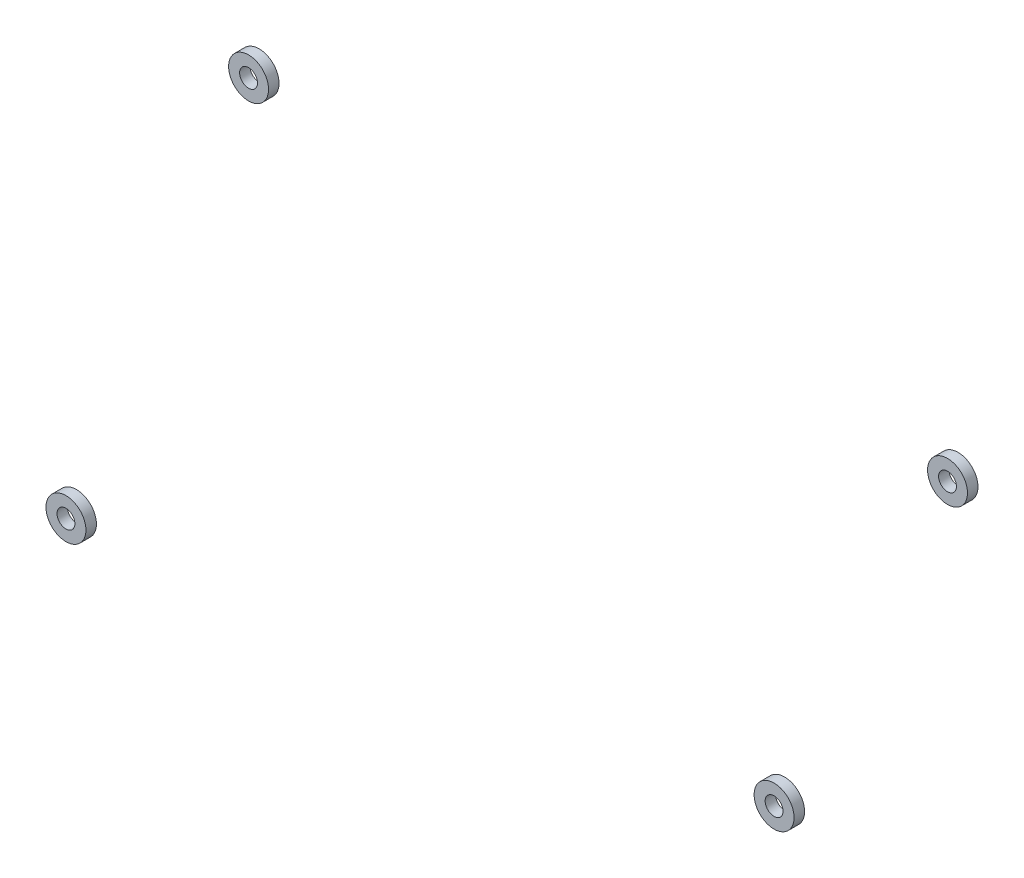
ISO-10303-21;
HEADER;
FILE_DESCRIPTION(('STEP AP214'),'2;1');
FILE_NAME('part.step','',(''),(''),'','','');
FILE_SCHEMA(('AUTOMOTIVE_DESIGN { 1 0 10303 214 1 1 1 1 }'));
ENDSEC;
DATA;
#1=APPLICATION_CONTEXT('core data for automotive mechanical design processes');
#2=APPLICATION_PROTOCOL_DEFINITION('international standard','automotive_design',2000,#1);
#3=PRODUCT_CONTEXT('',#1,'mechanical');
#4=PRODUCT('Part','Part','',(#3));
#5=PRODUCT_RELATED_PRODUCT_CATEGORY('part','',(#4));
#6=PRODUCT_DEFINITION_FORMATION('','',#4);
#7=PRODUCT_DEFINITION_CONTEXT('part definition',#1,'design');
#8=PRODUCT_DEFINITION('design','',#6,#7);
#9=PRODUCT_DEFINITION_SHAPE('','',#8);
#10=(LENGTH_UNIT() NAMED_UNIT(*) SI_UNIT(.MILLI.,.METRE.));
#11=(NAMED_UNIT(*) PLANE_ANGLE_UNIT() SI_UNIT($,.RADIAN.));
#12=(NAMED_UNIT(*) SI_UNIT($,.STERADIAN.) SOLID_ANGLE_UNIT());
#13=UNCERTAINTY_MEASURE_WITH_UNIT(LENGTH_MEASURE(1.E-05),#10,'distance_accuracy_value','');
#14=(GEOMETRIC_REPRESENTATION_CONTEXT(3) GLOBAL_UNCERTAINTY_ASSIGNED_CONTEXT((#13)) GLOBAL_UNIT_ASSIGNED_CONTEXT((#10,
#11,#12)) REPRESENTATION_CONTEXT('',''));
#15=CARTESIAN_POINT('',(0.,0.,0.));
#16=DIRECTION('',(0.,0.,1.));
#17=DIRECTION('',(1.,0.,0.));
#18=AXIS2_PLACEMENT_3D('',#15,#16,#17);
#19=CARTESIAN_POINT('',(-11.25,-52.,2.));
#20=DIRECTION('',(0.,0.,1.));
#21=DIRECTION('',(1.,0.,0.));
#22=AXIS2_PLACEMENT_3D('',#19,#20,#21);
#23=PLANE('',#22);
#24=CARTESIAN_POINT('',(-11.25,-52.,2.));
#25=DIRECTION('',(0.,0.,1.));
#26=DIRECTION('',(1.,0.,0.));
#27=AXIS2_PLACEMENT_3D('',#24,#25,#26);
#28=CIRCLE('',#27,3.8);
#29=CARTESIAN_POINT('',(-7.45,-52.,2.));
#30=VERTEX_POINT('',#29);
#31=EDGE_CURVE('E11',#30,#30,#28,.T.);
#32=ORIENTED_EDGE('',*,*,#31,.T.);
#33=EDGE_LOOP('',(#32));
#34=FACE_BOUND('',#33,.T.);
#35=CARTESIAN_POINT('',(-11.25,-52.,2.));
#36=DIRECTION('',(0.,0.,1.));
#37=DIRECTION('',(1.,0.,0.));
#38=AXIS2_PLACEMENT_3D('',#35,#36,#37);
#39=CIRCLE('',#38,1.7);
#40=CARTESIAN_POINT('',(-9.55,-52.,2.));
#41=VERTEX_POINT('',#40);
#42=EDGE_CURVE('E55',#41,#41,#39,.T.);
#43=ORIENTED_EDGE('',*,*,#42,.F.);
#44=EDGE_LOOP('',(#43));
#45=FACE_BOUND('',#44,.T.);
#46=ADVANCED_FACE('F44',(#34,#45),#23,.T.);
#47=CARTESIAN_POINT('',(-11.25,-52.,0.));
#48=DIRECTION('',(0.,0.,1.));
#49=DIRECTION('',(1.,0.,0.));
#50=AXIS2_PLACEMENT_3D('',#47,#48,#49);
#51=PLANE('',#50);
#52=CARTESIAN_POINT('',(-11.25,-52.,0.));
#53=DIRECTION('',(0.,0.,1.));
#54=DIRECTION('',(1.,0.,0.));
#55=AXIS2_PLACEMENT_3D('',#52,#53,#54);
#56=CIRCLE('',#55,3.8);
#57=CARTESIAN_POINT('',(-7.45,-52.,0.));
#58=VERTEX_POINT('',#57);
#59=EDGE_CURVE('E48',#58,#58,#56,.T.);
#60=ORIENTED_EDGE('',*,*,#59,.F.);
#61=EDGE_LOOP('',(#60));
#62=FACE_BOUND('',#61,.T.);
#63=CARTESIAN_POINT('',(-11.25,-52.,0.));
#64=DIRECTION('',(0.,0.,1.));
#65=DIRECTION('',(1.,0.,0.));
#66=AXIS2_PLACEMENT_3D('',#63,#64,#65);
#67=CIRCLE('',#66,1.7);
#68=CARTESIAN_POINT('',(-9.55,-52.,0.));
#69=VERTEX_POINT('',#68);
#70=EDGE_CURVE('E57',#69,#69,#67,.T.);
#71=ORIENTED_EDGE('',*,*,#70,.T.);
#72=EDGE_LOOP('',(#71));
#73=FACE_BOUND('',#72,.T.);
#74=ADVANCED_FACE('F67',(#62,#73),#51,.F.);
#75=CARTESIAN_POINT('',(-11.25,-52.,2.));
#76=DIRECTION('',(0.,0.,-1.));
#77=DIRECTION('',(-1.,0.,0.));
#78=AXIS2_PLACEMENT_3D('',#75,#76,#77);
#79=CYLINDRICAL_SURFACE('',#78,3.8);
#80=ORIENTED_EDGE('',*,*,#31,.F.);
#81=EDGE_LOOP('',(#80));
#82=FACE_BOUND('',#81,.T.);
#83=ORIENTED_EDGE('',*,*,#59,.T.);
#84=EDGE_LOOP('',(#83));
#85=FACE_BOUND('',#84,.T.);
#86=ADVANCED_FACE('F46',(#82,#85),#79,.T.);
#87=CARTESIAN_POINT('',(-11.25,-52.,2.));
#88=DIRECTION('',(0.,0.,-1.));
#89=DIRECTION('',(-1.,0.,0.));
#90=AXIS2_PLACEMENT_3D('',#87,#88,#89);
#91=CYLINDRICAL_SURFACE('',#90,1.7);
#92=ORIENTED_EDGE('',*,*,#42,.T.);
#93=EDGE_LOOP('',(#92));
#94=FACE_BOUND('',#93,.T.);
#95=ORIENTED_EDGE('',*,*,#70,.F.);
#96=EDGE_LOOP('',(#95));
#97=FACE_BOUND('',#96,.T.);
#98=ADVANCED_FACE('F63',(#94,#97),#91,.F.);
#99=CLOSED_SHELL('',(#46,#74,#86,#98));
#100=MANIFOLD_SOLID_BREP('B2',#99);
#101=CARTESIAN_POINT('',(123.5,-32.,2.));
#102=DIRECTION('',(0.,0.,1.));
#103=DIRECTION('',(1.,0.,0.));
#104=AXIS2_PLACEMENT_3D('',#101,#102,#103);
#105=PLANE('',#104);
#106=CARTESIAN_POINT('',(123.5,-32.,2.));
#107=DIRECTION('',(0.,0.,1.));
#108=DIRECTION('',(1.,0.,0.));
#109=AXIS2_PLACEMENT_3D('',#106,#107,#108);
#110=CIRCLE('',#109,3.8);
#111=CARTESIAN_POINT('',(127.3,-32.,2.));
#112=VERTEX_POINT('',#111);
#113=EDGE_CURVE('E43',#112,#112,#110,.T.);
#114=ORIENTED_EDGE('',*,*,#113,.T.);
#115=EDGE_LOOP('',(#114));
#116=FACE_BOUND('',#115,.T.);
#117=CARTESIAN_POINT('',(123.5,-32.,2.));
#118=DIRECTION('',(0.,0.,1.));
#119=DIRECTION('',(1.,0.,0.));
#120=AXIS2_PLACEMENT_3D('',#117,#118,#119);
#121=CIRCLE('',#120,1.70000000000001);
#122=CARTESIAN_POINT('',(125.2,-32.,2.));
#123=VERTEX_POINT('',#122);
#124=EDGE_CURVE('E125',#123,#123,#121,.T.);
#125=ORIENTED_EDGE('',*,*,#124,.F.);
#126=EDGE_LOOP('',(#125));
#127=FACE_BOUND('',#126,.T.);
#128=ADVANCED_FACE('F114',(#116,#127),#105,.T.);
#129=CARTESIAN_POINT('',(123.5,-32.,0.));
#130=DIRECTION('',(0.,0.,1.));
#131=DIRECTION('',(1.,0.,0.));
#132=AXIS2_PLACEMENT_3D('',#129,#130,#131);
#133=PLANE('',#132);
#134=CARTESIAN_POINT('',(123.5,-32.,0.));
#135=DIRECTION('',(0.,0.,1.));
#136=DIRECTION('',(1.,0.,0.));
#137=AXIS2_PLACEMENT_3D('',#134,#135,#136);
#138=CIRCLE('',#137,3.8);
#139=CARTESIAN_POINT('',(127.3,-32.,0.));
#140=VERTEX_POINT('',#139);
#141=EDGE_CURVE('E118',#140,#140,#138,.T.);
#142=ORIENTED_EDGE('',*,*,#141,.F.);
#143=EDGE_LOOP('',(#142));
#144=FACE_BOUND('',#143,.T.);
#145=CARTESIAN_POINT('',(123.5,-32.,0.));
#146=DIRECTION('',(0.,0.,1.));
#147=DIRECTION('',(1.,0.,0.));
#148=AXIS2_PLACEMENT_3D('',#145,#146,#147);
#149=CIRCLE('',#148,1.70000000000001);
#150=CARTESIAN_POINT('',(125.2,-32.,0.));
#151=VERTEX_POINT('',#150);
#152=EDGE_CURVE('E127',#151,#151,#149,.T.);
#153=ORIENTED_EDGE('',*,*,#152,.T.);
#154=EDGE_LOOP('',(#153));
#155=FACE_BOUND('',#154,.T.);
#156=ADVANCED_FACE('F137',(#144,#155),#133,.F.);
#157=CARTESIAN_POINT('',(123.5,-32.,2.));
#158=DIRECTION('',(0.,0.,-1.));
#159=DIRECTION('',(-1.,0.,0.));
#160=AXIS2_PLACEMENT_3D('',#157,#158,#159);
#161=CYLINDRICAL_SURFACE('',#160,3.8);
#162=ORIENTED_EDGE('',*,*,#113,.F.);
#163=EDGE_LOOP('',(#162));
#164=FACE_BOUND('',#163,.T.);
#165=ORIENTED_EDGE('',*,*,#141,.T.);
#166=EDGE_LOOP('',(#165));
#167=FACE_BOUND('',#166,.T.);
#168=ADVANCED_FACE('F116',(#164,#167),#161,.T.);
#169=CARTESIAN_POINT('',(123.5,-32.,2.));
#170=DIRECTION('',(0.,0.,-1.));
#171=DIRECTION('',(-1.,0.,0.));
#172=AXIS2_PLACEMENT_3D('',#169,#170,#171);
#173=CYLINDRICAL_SURFACE('',#172,1.70000000000001);
#174=ORIENTED_EDGE('',*,*,#124,.T.);
#175=EDGE_LOOP('',(#174));
#176=FACE_BOUND('',#175,.T.);
#177=ORIENTED_EDGE('',*,*,#152,.F.);
#178=EDGE_LOOP('',(#177));
#179=FACE_BOUND('',#178,.T.);
#180=ADVANCED_FACE('F133',(#176,#179),#173,.F.);
#181=CLOSED_SHELL('',(#128,#156,#168,#180));
#182=MANIFOLD_SOLID_BREP('B6',#181);
#183=CARTESIAN_POINT('',(156.5,38.,2.));
#184=DIRECTION('',(0.,0.,1.));
#185=DIRECTION('',(1.,0.,0.));
#186=AXIS2_PLACEMENT_3D('',#183,#184,#185);
#187=PLANE('',#186);
#188=CARTESIAN_POINT('',(156.5,38.,2.));
#189=DIRECTION('',(0.,0.,1.));
#190=DIRECTION('',(1.,0.,0.));
#191=AXIS2_PLACEMENT_3D('',#188,#189,#190);
#192=CIRCLE('',#191,3.8);
#193=CARTESIAN_POINT('',(160.3,38.,2.));
#194=VERTEX_POINT('',#193);
#195=EDGE_CURVE('E113',#194,#194,#192,.T.);
#196=ORIENTED_EDGE('',*,*,#195,.T.);
#197=EDGE_LOOP('',(#196));
#198=FACE_BOUND('',#197,.T.);
#199=CARTESIAN_POINT('',(156.5,38.,2.));
#200=DIRECTION('',(0.,0.,1.));
#201=DIRECTION('',(1.,0.,0.));
#202=AXIS2_PLACEMENT_3D('',#199,#200,#201);
#203=CIRCLE('',#202,1.70000000000001);
#204=CARTESIAN_POINT('',(158.2,38.,2.));
#205=VERTEX_POINT('',#204);
#206=EDGE_CURVE('E194',#205,#205,#203,.T.);
#207=ORIENTED_EDGE('',*,*,#206,.F.);
#208=EDGE_LOOP('',(#207));
#209=FACE_BOUND('',#208,.T.);
#210=ADVANCED_FACE('F183',(#198,#209),#187,.T.);
#211=CARTESIAN_POINT('',(156.5,38.,0.));
#212=DIRECTION('',(0.,0.,1.));
#213=DIRECTION('',(1.,0.,0.));
#214=AXIS2_PLACEMENT_3D('',#211,#212,#213);
#215=PLANE('',#214);
#216=CARTESIAN_POINT('',(156.5,38.,0.));
#217=DIRECTION('',(0.,0.,1.));
#218=DIRECTION('',(1.,0.,0.));
#219=AXIS2_PLACEMENT_3D('',#216,#217,#218);
#220=CIRCLE('',#219,3.8);
#221=CARTESIAN_POINT('',(160.3,38.,0.));
#222=VERTEX_POINT('',#221);
#223=EDGE_CURVE('E187',#222,#222,#220,.T.);
#224=ORIENTED_EDGE('',*,*,#223,.F.);
#225=EDGE_LOOP('',(#224));
#226=FACE_BOUND('',#225,.T.);
#227=CARTESIAN_POINT('',(156.5,38.,0.));
#228=DIRECTION('',(0.,0.,1.));
#229=DIRECTION('',(1.,0.,0.));
#230=AXIS2_PLACEMENT_3D('',#227,#228,#229);
#231=CIRCLE('',#230,1.70000000000001);
#232=CARTESIAN_POINT('',(158.2,38.,0.));
#233=VERTEX_POINT('',#232);
#234=EDGE_CURVE('E196',#233,#233,#231,.T.);
#235=ORIENTED_EDGE('',*,*,#234,.T.);
#236=EDGE_LOOP('',(#235));
#237=FACE_BOUND('',#236,.T.);
#238=ADVANCED_FACE('F206',(#226,#237),#215,.F.);
#239=CARTESIAN_POINT('',(156.5,38.,2.));
#240=DIRECTION('',(0.,0.,-1.));
#241=DIRECTION('',(-1.,0.,0.));
#242=AXIS2_PLACEMENT_3D('',#239,#240,#241);
#243=CYLINDRICAL_SURFACE('',#242,3.8);
#244=ORIENTED_EDGE('',*,*,#195,.F.);
#245=EDGE_LOOP('',(#244));
#246=FACE_BOUND('',#245,.T.);
#247=ORIENTED_EDGE('',*,*,#223,.T.);
#248=EDGE_LOOP('',(#247));
#249=FACE_BOUND('',#248,.T.);
#250=ADVANCED_FACE('F185',(#246,#249),#243,.T.);
#251=CARTESIAN_POINT('',(156.5,38.,2.));
#252=DIRECTION('',(0.,0.,-1.));
#253=DIRECTION('',(-1.,0.,0.));
#254=AXIS2_PLACEMENT_3D('',#251,#252,#253);
#255=CYLINDRICAL_SURFACE('',#254,1.70000000000001);
#256=ORIENTED_EDGE('',*,*,#206,.T.);
#257=EDGE_LOOP('',(#256));
#258=FACE_BOUND('',#257,.T.);
#259=ORIENTED_EDGE('',*,*,#234,.F.);
#260=EDGE_LOOP('',(#259));
#261=FACE_BOUND('',#260,.T.);
#262=ADVANCED_FACE('F202',(#258,#261),#255,.F.);
#263=CLOSED_SHELL('',(#210,#238,#250,#262));
#264=MANIFOLD_SOLID_BREP('B38',#263);
#265=CARTESIAN_POINT('',(23.5,38.,2.));
#266=DIRECTION('',(0.,0.,1.));
#267=DIRECTION('',(1.,0.,0.));
#268=AXIS2_PLACEMENT_3D('',#265,#266,#267);
#269=PLANE('',#268);
#270=CARTESIAN_POINT('',(23.5,38.,2.));
#271=DIRECTION('',(0.,0.,1.));
#272=DIRECTION('',(1.,0.,0.));
#273=AXIS2_PLACEMENT_3D('',#270,#271,#272);
#274=CIRCLE('',#273,3.8);
#275=CARTESIAN_POINT('',(27.3,38.,2.));
#276=VERTEX_POINT('',#275);
#277=EDGE_CURVE('E182',#276,#276,#274,.T.);
#278=ORIENTED_EDGE('',*,*,#277,.T.);
#279=EDGE_LOOP('',(#278));
#280=FACE_BOUND('',#279,.T.);
#281=CARTESIAN_POINT('',(23.5,38.,2.));
#282=DIRECTION('',(0.,0.,1.));
#283=DIRECTION('',(1.,0.,0.));
#284=AXIS2_PLACEMENT_3D('',#281,#282,#283);
#285=CIRCLE('',#284,1.7);
#286=CARTESIAN_POINT('',(25.2,38.,2.));
#287=VERTEX_POINT('',#286);
#288=EDGE_CURVE('E256',#287,#287,#285,.T.);
#289=ORIENTED_EDGE('',*,*,#288,.F.);
#290=EDGE_LOOP('',(#289));
#291=FACE_BOUND('',#290,.T.);
#292=ADVANCED_FACE('F245',(#280,#291),#269,.T.);
#293=CARTESIAN_POINT('',(23.5,38.,0.));
#294=DIRECTION('',(0.,0.,1.));
#295=DIRECTION('',(1.,0.,0.));
#296=AXIS2_PLACEMENT_3D('',#293,#294,#295);
#297=PLANE('',#296);
#298=CARTESIAN_POINT('',(23.5,38.,0.));
#299=DIRECTION('',(0.,0.,1.));
#300=DIRECTION('',(1.,0.,0.));
#301=AXIS2_PLACEMENT_3D('',#298,#299,#300);
#302=CIRCLE('',#301,3.8);
#303=CARTESIAN_POINT('',(27.3,38.,0.));
#304=VERTEX_POINT('',#303);
#305=EDGE_CURVE('E249',#304,#304,#302,.T.);
#306=ORIENTED_EDGE('',*,*,#305,.F.);
#307=EDGE_LOOP('',(#306));
#308=FACE_BOUND('',#307,.T.);
#309=CARTESIAN_POINT('',(23.5,38.,0.));
#310=DIRECTION('',(0.,0.,1.));
#311=DIRECTION('',(1.,0.,0.));
#312=AXIS2_PLACEMENT_3D('',#309,#310,#311);
#313=CIRCLE('',#312,1.7);
#314=CARTESIAN_POINT('',(25.2,38.,0.));
#315=VERTEX_POINT('',#314);
#316=EDGE_CURVE('E258',#315,#315,#313,.T.);
#317=ORIENTED_EDGE('',*,*,#316,.T.);
#318=EDGE_LOOP('',(#317));
#319=FACE_BOUND('',#318,.T.);
#320=ADVANCED_FACE('F268',(#308,#319),#297,.F.);
#321=CARTESIAN_POINT('',(23.5,38.,2.));
#322=DIRECTION('',(0.,0.,-1.));
#323=DIRECTION('',(-1.,0.,0.));
#324=AXIS2_PLACEMENT_3D('',#321,#322,#323);
#325=CYLINDRICAL_SURFACE('',#324,3.8);
#326=ORIENTED_EDGE('',*,*,#277,.F.);
#327=EDGE_LOOP('',(#326));
#328=FACE_BOUND('',#327,.T.);
#329=ORIENTED_EDGE('',*,*,#305,.T.);
#330=EDGE_LOOP('',(#329));
#331=FACE_BOUND('',#330,.T.);
#332=ADVANCED_FACE('F247',(#328,#331),#325,.T.);
#333=CARTESIAN_POINT('',(23.5,38.,2.));
#334=DIRECTION('',(0.,0.,-1.));
#335=DIRECTION('',(-1.,0.,0.));
#336=AXIS2_PLACEMENT_3D('',#333,#334,#335);
#337=CYLINDRICAL_SURFACE('',#336,1.7);
#338=ORIENTED_EDGE('',*,*,#288,.T.);
#339=EDGE_LOOP('',(#338));
#340=FACE_BOUND('',#339,.T.);
#341=ORIENTED_EDGE('',*,*,#316,.F.);
#342=EDGE_LOOP('',(#341));
#343=FACE_BOUND('',#342,.T.);
#344=ADVANCED_FACE('F264',(#340,#343),#337,.F.);
#345=CLOSED_SHELL('',(#292,#320,#332,#344));
#346=MANIFOLD_SOLID_BREP('B108',#345);
#347=ADVANCED_BREP_SHAPE_REPRESENTATION('',(#18,#100,#182,#264,#346),#14);
#348=SHAPE_DEFINITION_REPRESENTATION(#9,#347);
ENDSEC;
END-ISO-10303-21;
